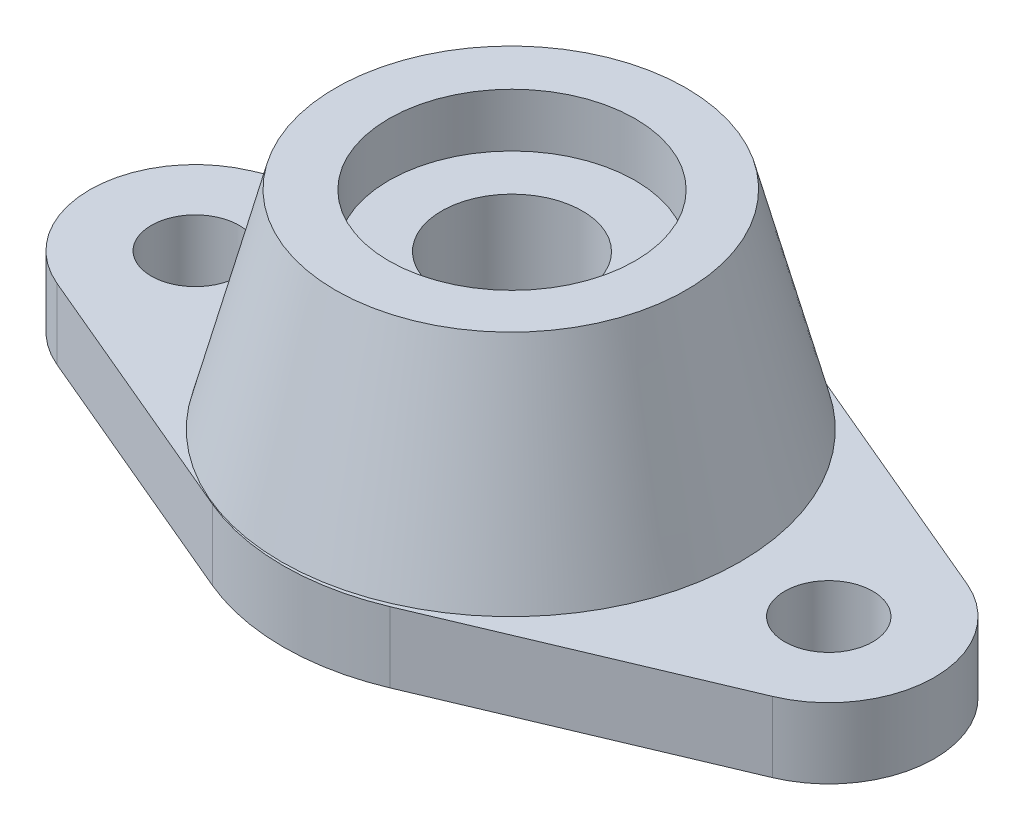
ISO-10303-21;
HEADER;
FILE_DESCRIPTION(('STEP AP214'),'2;1');
FILE_NAME('part.step','',(''),(''),'','','');
FILE_SCHEMA(('AUTOMOTIVE_DESIGN { 1 0 10303 214 1 1 1 1 }'));
ENDSEC;
DATA;
#1=APPLICATION_CONTEXT('core data for automotive mechanical design processes');
#2=APPLICATION_PROTOCOL_DEFINITION('international standard','automotive_design',2000,#1);
#3=PRODUCT_CONTEXT('',#1,'mechanical');
#4=PRODUCT('Part','Part','',(#3));
#5=PRODUCT_RELATED_PRODUCT_CATEGORY('part','',(#4));
#6=PRODUCT_DEFINITION_FORMATION('','',#4);
#7=PRODUCT_DEFINITION_CONTEXT('part definition',#1,'design');
#8=PRODUCT_DEFINITION('design','',#6,#7);
#9=PRODUCT_DEFINITION_SHAPE('','',#8);
#10=(LENGTH_UNIT() NAMED_UNIT(*) SI_UNIT(.MILLI.,.METRE.));
#11=(NAMED_UNIT(*) PLANE_ANGLE_UNIT() SI_UNIT($,.RADIAN.));
#12=(NAMED_UNIT(*) SI_UNIT($,.STERADIAN.) SOLID_ANGLE_UNIT());
#13=UNCERTAINTY_MEASURE_WITH_UNIT(LENGTH_MEASURE(1.E-05),#10,'distance_accuracy_value','');
#14=(GEOMETRIC_REPRESENTATION_CONTEXT(3) GLOBAL_UNCERTAINTY_ASSIGNED_CONTEXT((#13)) GLOBAL_UNIT_ASSIGNED_CONTEXT((#10,
#11,#12)) REPRESENTATION_CONTEXT('',''));
#15=CARTESIAN_POINT('',(0.,0.,0.));
#16=DIRECTION('',(0.,0.,1.));
#17=DIRECTION('',(1.,0.,0.));
#18=AXIS2_PLACEMENT_3D('',#15,#16,#17);
#19=CARTESIAN_POINT('',(41.1844595659896,13.2676954235819,0.));
#20=DIRECTION('',(0.,-1.,0.));
#21=DIRECTION('',(0.,0.,-1.));
#22=AXIS2_PLACEMENT_3D('',#19,#20,#21);
#23=PLANE('',#22);
#24=CARTESIAN_POINT('',(0.,13.2676954235819,0.));
#25=DIRECTION('',(0.,-1.,0.));
#26=DIRECTION('',(0.,0.,-1.));
#27=AXIS2_PLACEMENT_3D('',#24,#25,#26);
#28=CIRCLE('',#27,19.05);
#29=CARTESIAN_POINT('',(0.,13.2676954235819,-19.05));
#30=VERTEX_POINT('',#29);
#31=EDGE_CURVE('E54',#30,#30,#28,.F.);
#32=ORIENTED_EDGE('',*,*,#31,.T.);
#33=EDGE_LOOP('',(#32));
#34=FACE_BOUND('',#33,.T.);
#35=CARTESIAN_POINT('',(-0.217540434010357,13.2676954235819,0.));
#36=DIRECTION('',(0.,-1.,0.));
#37=DIRECTION('',(0.,0.,-1.));
#38=AXIS2_PLACEMENT_3D('',#35,#36,#37);
#39=CIRCLE('',#38,41.402);
#40=CARTESIAN_POINT('',(-0.217540434010357,13.2676954235819,-41.402));
#41=VERTEX_POINT('',#40);
#42=EDGE_CURVE('E59',#41,#41,#39,.T.);
#43=ORIENTED_EDGE('',*,*,#42,.T.);
#44=EDGE_LOOP('',(#43));
#45=FACE_BOUND('',#44,.T.);
#46=ADVANCED_FACE('F51',(#34,#45),#23,.T.);
#47=CARTESIAN_POINT('',(-0.217540434010357,50.8,0.));
#48=DIRECTION('',(0.,1.,0.));
#49=DIRECTION('',(0.,0.,1.));
#50=AXIS2_PLACEMENT_3D('',#47,#48,#49);
#51=PLANE('',#50);
#52=CARTESIAN_POINT('',(0.,50.8,0.));
#53=DIRECTION('',(0.,1.,0.));
#54=DIRECTION('',(0.,0.,1.));
#55=AXIS2_PLACEMENT_3D('',#52,#53,#54);
#56=CIRCLE('',#55,22.225);
#57=CARTESIAN_POINT('',(0.,50.8,22.225));
#58=VERTEX_POINT('',#57);
#59=EDGE_CURVE('E66',#58,#58,#56,.T.);
#60=ORIENTED_EDGE('',*,*,#59,.F.);
#61=EDGE_LOOP('',(#60));
#62=FACE_BOUND('',#61,.T.);
#63=CARTESIAN_POINT('',(-0.217540434010357,50.8,0.));
#64=DIRECTION('',(0.,-1.,0.));
#65=DIRECTION('',(0.,0.,-1.));
#66=AXIS2_PLACEMENT_3D('',#63,#64,#65);
#67=CIRCLE('',#66,31.6178702226304);
#68=CARTESIAN_POINT('',(-0.217540434010357,50.8,-31.6178702226304));
#69=VERTEX_POINT('',#68);
#70=EDGE_CURVE('E11',#69,#69,#67,.T.);
#71=ORIENTED_EDGE('',*,*,#70,.F.);
#72=EDGE_LOOP('',(#71));
#73=FACE_BOUND('',#72,.T.);
#74=ADVANCED_FACE('F104',(#62,#73),#51,.T.);
#75=CARTESIAN_POINT('',(-0.217540434010357,13.2676954235819,0.));
#76=DIRECTION('',(0.,-1.,0.));
#77=DIRECTION('',(0.,0.,-1.));
#78=AXIS2_PLACEMENT_3D('',#75,#76,#77);
#79=CONICAL_SURFACE('',#78,41.402,0.255010100410673);
#80=ORIENTED_EDGE('',*,*,#70,.T.);
#81=EDGE_LOOP('',(#80));
#82=FACE_BOUND('',#81,.T.);
#83=ORIENTED_EDGE('',*,*,#42,.F.);
#84=EDGE_LOOP('',(#83));
#85=FACE_BOUND('',#84,.T.);
#86=ADVANCED_FACE('F109',(#82,#85),#79,.T.);
#87=CARTESIAN_POINT('',(0.,50.8,0.));
#88=DIRECTION('',(0.,1.,0.));
#89=DIRECTION('',(0.,0.,1.));
#90=AXIS2_PLACEMENT_3D('',#87,#88,#89);
#91=CYLINDRICAL_SURFACE('',#90,22.225);
#92=ORIENTED_EDGE('',*,*,#59,.T.);
#93=EDGE_LOOP('',(#92));
#94=FACE_BOUND('',#93,.T.);
#95=CARTESIAN_POINT('',(0.,41.148,0.));
#96=DIRECTION('',(0.,1.,0.));
#97=DIRECTION('',(0.,0.,1.));
#98=AXIS2_PLACEMENT_3D('',#95,#96,#97);
#99=CIRCLE('',#98,22.225);
#100=CARTESIAN_POINT('',(0.,41.148,22.225));
#101=VERTEX_POINT('',#100);
#102=EDGE_CURVE('E70',#101,#101,#99,.T.);
#103=ORIENTED_EDGE('',*,*,#102,.F.);
#104=EDGE_LOOP('',(#103));
#105=FACE_BOUND('',#104,.T.);
#106=ADVANCED_FACE('F117',(#94,#105),#91,.F.);
#107=CARTESIAN_POINT('',(22.225,41.148,0.));
#108=DIRECTION('',(0.,1.,0.));
#109=DIRECTION('',(0.,0.,1.));
#110=AXIS2_PLACEMENT_3D('',#107,#108,#109);
#111=PLANE('',#110);
#112=ORIENTED_EDGE('',*,*,#102,.T.);
#113=EDGE_LOOP('',(#112));
#114=FACE_BOUND('',#113,.T.);
#115=CARTESIAN_POINT('',(0.,41.148,0.));
#116=DIRECTION('',(0.,1.,0.));
#117=DIRECTION('',(0.,0.,1.));
#118=AXIS2_PLACEMENT_3D('',#115,#116,#117);
#119=CIRCLE('',#118,12.7);
#120=CARTESIAN_POINT('',(0.,41.148,12.7));
#121=VERTEX_POINT('',#120);
#122=EDGE_CURVE('E74',#121,#121,#119,.T.);
#123=ORIENTED_EDGE('',*,*,#122,.F.);
#124=EDGE_LOOP('',(#123));
#125=FACE_BOUND('',#124,.T.);
#126=ADVANCED_FACE('F100',(#114,#125),#111,.T.);
#127=CARTESIAN_POINT('',(0.,50.8,0.));
#128=DIRECTION('',(0.,1.,0.));
#129=DIRECTION('',(0.,0.,1.));
#130=AXIS2_PLACEMENT_3D('',#127,#128,#129);
#131=CYLINDRICAL_SURFACE('',#130,12.7);
#132=ORIENTED_EDGE('',*,*,#122,.T.);
#133=EDGE_LOOP('',(#132));
#134=FACE_BOUND('',#133,.T.);
#135=CARTESIAN_POINT('',(0.,25.4,0.));
#136=DIRECTION('',(0.,1.,0.));
#137=DIRECTION('',(0.,0.,1.));
#138=AXIS2_PLACEMENT_3D('',#135,#136,#137);
#139=CIRCLE('',#138,12.7);
#140=CARTESIAN_POINT('',(0.,25.4,12.7));
#141=VERTEX_POINT('',#140);
#142=EDGE_CURVE('E78',#141,#141,#139,.T.);
#143=ORIENTED_EDGE('',*,*,#142,.F.);
#144=EDGE_LOOP('',(#143));
#145=FACE_BOUND('',#144,.T.);
#146=ADVANCED_FACE('F91',(#134,#145),#131,.F.);
#147=CARTESIAN_POINT('',(0.,19.05,0.));
#148=DIRECTION('',(0.,-1.,0.));
#149=DIRECTION('',(0.,0.,-1.));
#150=AXIS2_PLACEMENT_3D('',#147,#148,#149);
#151=CONICAL_SURFACE('',#150,19.05,0.785398163397448);
#152=ORIENTED_EDGE('',*,*,#142,.T.);
#153=EDGE_LOOP('',(#152));
#154=FACE_BOUND('',#153,.T.);
#155=CARTESIAN_POINT('',(0.,19.05,0.));
#156=DIRECTION('',(0.,1.,0.));
#157=DIRECTION('',(0.,0.,1.));
#158=AXIS2_PLACEMENT_3D('',#155,#156,#157);
#159=CIRCLE('',#158,19.05);
#160=CARTESIAN_POINT('',(0.,19.05,19.05));
#161=VERTEX_POINT('',#160);
#162=EDGE_CURVE('E82',#161,#161,#159,.T.);
#163=ORIENTED_EDGE('',*,*,#162,.F.);
#164=EDGE_LOOP('',(#163));
#165=FACE_BOUND('',#164,.T.);
#166=ADVANCED_FACE('F89',(#154,#165),#151,.F.);
#167=CARTESIAN_POINT('',(0.,50.8,0.));
#168=DIRECTION('',(0.,1.,0.));
#169=DIRECTION('',(0.,0.,1.));
#170=AXIS2_PLACEMENT_3D('',#167,#168,#169);
#171=CYLINDRICAL_SURFACE('',#170,19.05);
#172=ORIENTED_EDGE('',*,*,#31,.F.);
#173=EDGE_LOOP('',(#172));
#174=FACE_BOUND('',#173,.T.);
#175=ORIENTED_EDGE('',*,*,#162,.T.);
#176=EDGE_LOOP('',(#175));
#177=FACE_BOUND('',#176,.T.);
#178=ADVANCED_FACE('F87',(#174,#177),#171,.F.);
#179=CLOSED_SHELL('',(#46,#74,#86,#106,#126,#146,#166,#178));
#180=MANIFOLD_SOLID_BREP('B2',#179);
#181=CARTESIAN_POINT('',(-57.15,12.7,0.));
#182=DIRECTION('',(0.,1.,0.));
#183=DIRECTION('',(0.,0.,1.));
#184=AXIS2_PLACEMENT_3D('',#181,#182,#183);
#185=PLANE('',#184);
#186=CARTESIAN_POINT('',(0.,12.7,0.));
#187=DIRECTION('',(0.,1.,0.));
#188=DIRECTION('',(0.,0.,1.));
#189=AXIS2_PLACEMENT_3D('',#186,#187,#188);
#190=CIRCLE('',#189,19.05);
#191=CARTESIAN_POINT('',(0.,12.7,19.05));
#192=VERTEX_POINT('',#191);
#193=EDGE_CURVE('E355',#192,#192,#190,.F.);
#194=ORIENTED_EDGE('',*,*,#193,.T.);
#195=EDGE_LOOP('',(#194));
#196=FACE_BOUND('',#195,.T.);
#197=CARTESIAN_POINT('',(-57.15,12.7,0.));
#198=DIRECTION('',(0.,1.,0.));
#199=DIRECTION('',(0.,0.,1.));
#200=AXIS2_PLACEMENT_3D('',#197,#198,#199);
#201=CIRCLE('',#200,7.9375);
#202=CARTESIAN_POINT('',(-57.15,12.7,7.9375));
#203=VERTEX_POINT('',#202);
#204=EDGE_CURVE('E301',#203,#203,#201,.T.);
#205=ORIENTED_EDGE('',*,*,#204,.F.);
#206=EDGE_LOOP('',(#205));
#207=FACE_BOUND('',#206,.T.);
#208=CARTESIAN_POINT('',(-57.15,12.7,0.));
#209=DIRECTION('',(0.,1.,0.));
#210=DIRECTION('',(0.,0.,1.));
#211=AXIS2_PLACEMENT_3D('',#208,#209,#210);
#212=CIRCLE('',#211,19.05);
#213=CARTESIAN_POINT('',(-64.5583333333333,12.7,-17.550472848964));
#214=VERTEX_POINT('',#213);
#215=CARTESIAN_POINT('',(-64.5583333333333,12.7,17.550472848964));
#216=VERTEX_POINT('',#215);
#217=EDGE_CURVE('E312',#214,#216,#212,.T.);
#218=ORIENTED_EDGE('',*,*,#217,.T.);
#219=DIRECTION('',(0.921284663987611,0.,0.388888888888889));
#220=VECTOR('',#219,1.);
#221=CARTESIAN_POINT('',(-64.5583333333333,12.7,17.550472848964));
#222=LINE('',#221,#220);
#223=CARTESIAN_POINT('',(-16.0513888888889,12.7,38.0260245060886));
#224=VERTEX_POINT('',#223);
#225=EDGE_CURVE('E260',#216,#224,#222,.T.);
#226=ORIENTED_EDGE('',*,*,#225,.T.);
#227=CARTESIAN_POINT('',(0.,12.7,0.));
#228=DIRECTION('',(0.,1.,0.));
#229=DIRECTION('',(0.,0.,1.));
#230=AXIS2_PLACEMENT_3D('',#227,#228,#229);
#231=CIRCLE('',#230,41.275);
#232=CARTESIAN_POINT('',(16.0513888888889,12.7,38.0260245060886));
#233=VERTEX_POINT('',#232);
#234=EDGE_CURVE('E327',#224,#233,#231,.T.);
#235=ORIENTED_EDGE('',*,*,#234,.T.);
#236=DIRECTION('',(0.921284663987611,0.,-0.388888888888889));
#237=VECTOR('',#236,1.);
#238=CARTESIAN_POINT('',(64.5583333333334,12.7,17.550472848964));
#239=LINE('',#238,#237);
#240=CARTESIAN_POINT('',(64.5583333333334,12.7,17.550472848964));
#241=VERTEX_POINT('',#240);
#242=EDGE_CURVE('E340',#233,#241,#239,.T.);
#243=ORIENTED_EDGE('',*,*,#242,.T.);
#244=CARTESIAN_POINT('',(57.15,12.7,0.));
#245=DIRECTION('',(0.,1.,0.));
#246=DIRECTION('',(0.,0.,1.));
#247=AXIS2_PLACEMENT_3D('',#244,#245,#246);
#248=CIRCLE('',#247,19.05);
#249=CARTESIAN_POINT('',(64.5583333333333,12.7,-17.550472848964));
#250=VERTEX_POINT('',#249);
#251=EDGE_CURVE('E279',#241,#250,#248,.T.);
#252=ORIENTED_EDGE('',*,*,#251,.T.);
#253=DIRECTION('',(-0.921284663987611,0.,-0.388888888888888));
#254=VECTOR('',#253,1.);
#255=CARTESIAN_POINT('',(64.5583333333333,12.7,-17.550472848964));
#256=LINE('',#255,#254);
#257=CARTESIAN_POINT('',(16.0513888888889,12.7,-38.0260245060887));
#258=VERTEX_POINT('',#257);
#259=EDGE_CURVE('E273',#250,#258,#256,.T.);
#260=ORIENTED_EDGE('',*,*,#259,.T.);
#261=CARTESIAN_POINT('',(0.,12.7,0.));
#262=DIRECTION('',(0.,1.,0.));
#263=DIRECTION('',(0.,0.,1.));
#264=AXIS2_PLACEMENT_3D('',#261,#262,#263);
#265=CIRCLE('',#264,41.275);
#266=CARTESIAN_POINT('',(-16.0513888888889,12.7,-38.0260245060886));
#267=VERTEX_POINT('',#266);
#268=EDGE_CURVE('E277',#258,#267,#265,.T.);
#269=ORIENTED_EDGE('',*,*,#268,.T.);
#270=DIRECTION('',(-0.921284663987611,0.,0.388888888888889));
#271=VECTOR('',#270,1.);
#272=CARTESIAN_POINT('',(-64.5583333333333,12.7,-17.550472848964));
#273=LINE('',#272,#271);
#274=EDGE_CURVE('E217',#267,#214,#273,.T.);
#275=ORIENTED_EDGE('',*,*,#274,.T.);
#276=EDGE_LOOP('',(#218,#226,#235,#243,#252,#260,#269,#275));
#277=FACE_BOUND('',#276,.T.);
#278=CARTESIAN_POINT('',(57.15,12.7,0.));
#279=DIRECTION('',(0.,1.,0.));
#280=DIRECTION('',(0.,0.,1.));
#281=AXIS2_PLACEMENT_3D('',#278,#279,#280);
#282=CIRCLE('',#281,7.93749999999999);
#283=CARTESIAN_POINT('',(57.15,12.7,7.93749999999998));
#284=VERTEX_POINT('',#283);
#285=EDGE_CURVE('E349',#284,#284,#282,.T.);
#286=ORIENTED_EDGE('',*,*,#285,.F.);
#287=EDGE_LOOP('',(#286));
#288=FACE_BOUND('',#287,.T.);
#289=ADVANCED_FACE('F200',(#196,#207,#277,#288),#185,.T.);
#290=CARTESIAN_POINT('',(-57.15,0.,0.));
#291=DIRECTION('',(0.,1.,0.));
#292=DIRECTION('',(0.,0.,1.));
#293=AXIS2_PLACEMENT_3D('',#290,#291,#292);
#294=PLANE('',#293);
#295=CARTESIAN_POINT('',(0.,0.,0.));
#296=DIRECTION('',(0.,1.,0.));
#297=DIRECTION('',(0.,0.,1.));
#298=AXIS2_PLACEMENT_3D('',#295,#296,#297);
#299=CIRCLE('',#298,19.05);
#300=CARTESIAN_POINT('',(0.,0.,19.05));
#301=VERTEX_POINT('',#300);
#302=EDGE_CURVE('E360',#301,#301,#299,.T.);
#303=ORIENTED_EDGE('',*,*,#302,.T.);
#304=EDGE_LOOP('',(#303));
#305=FACE_BOUND('',#304,.T.);
#306=CARTESIAN_POINT('',(-57.15,0.,0.));
#307=DIRECTION('',(0.,1.,0.));
#308=DIRECTION('',(0.,0.,1.));
#309=AXIS2_PLACEMENT_3D('',#306,#307,#308);
#310=CIRCLE('',#309,19.05);
#311=CARTESIAN_POINT('',(-64.5583333333333,0.,-17.550472848964));
#312=VERTEX_POINT('',#311);
#313=CARTESIAN_POINT('',(-64.5583333333333,0.,17.550472848964));
#314=VERTEX_POINT('',#313);
#315=EDGE_CURVE('E297',#312,#314,#310,.T.);
#316=ORIENTED_EDGE('',*,*,#315,.F.);
#317=DIRECTION('',(-0.921284663987611,0.,0.388888888888889));
#318=VECTOR('',#317,1.);
#319=CARTESIAN_POINT('',(-64.5583333333333,0.,-17.550472848964));
#320=LINE('',#319,#318);
#321=CARTESIAN_POINT('',(-16.0513888888889,0.,-38.0260245060886));
#322=VERTEX_POINT('',#321);
#323=EDGE_CURVE('E252',#322,#312,#320,.T.);
#324=ORIENTED_EDGE('',*,*,#323,.F.);
#325=CARTESIAN_POINT('',(0.,0.,0.));
#326=DIRECTION('',(0.,1.,0.));
#327=DIRECTION('',(0.,0.,1.));
#328=AXIS2_PLACEMENT_3D('',#325,#326,#327);
#329=CIRCLE('',#328,41.275);
#330=CARTESIAN_POINT('',(16.0513888888889,0.,-38.0260245060887));
#331=VERTEX_POINT('',#330);
#332=EDGE_CURVE('E246',#331,#322,#329,.T.);
#333=ORIENTED_EDGE('',*,*,#332,.F.);
#334=DIRECTION('',(-0.921284663987611,0.,-0.388888888888888));
#335=VECTOR('',#334,1.);
#336=CARTESIAN_POINT('',(64.5583333333333,0.,-17.550472848964));
#337=LINE('',#336,#335);
#338=CARTESIAN_POINT('',(64.5583333333333,0.,-17.550472848964));
#339=VERTEX_POINT('',#338);
#340=EDGE_CURVE('E287',#339,#331,#337,.T.);
#341=ORIENTED_EDGE('',*,*,#340,.F.);
#342=CARTESIAN_POINT('',(57.15,0.,0.));
#343=DIRECTION('',(0.,1.,0.));
#344=DIRECTION('',(0.,0.,1.));
#345=AXIS2_PLACEMENT_3D('',#342,#343,#344);
#346=CIRCLE('',#345,19.05);
#347=CARTESIAN_POINT('',(64.5583333333334,0.,17.550472848964));
#348=VERTEX_POINT('',#347);
#349=EDGE_CURVE('E307',#348,#339,#346,.T.);
#350=ORIENTED_EDGE('',*,*,#349,.F.);
#351=DIRECTION('',(0.921284663987611,0.,-0.388888888888889));
#352=VECTOR('',#351,1.);
#353=CARTESIAN_POINT('',(64.5583333333334,0.,17.550472848964));
#354=LINE('',#353,#352);
#355=CARTESIAN_POINT('',(16.0513888888889,0.,38.0260245060886));
#356=VERTEX_POINT('',#355);
#357=EDGE_CURVE('E305',#356,#348,#354,.T.);
#358=ORIENTED_EDGE('',*,*,#357,.F.);
#359=CARTESIAN_POINT('',(0.,0.,0.));
#360=DIRECTION('',(0.,1.,0.));
#361=DIRECTION('',(0.,0.,1.));
#362=AXIS2_PLACEMENT_3D('',#359,#360,#361);
#363=CIRCLE('',#362,41.275);
#364=CARTESIAN_POINT('',(-16.0513888888889,0.,38.0260245060886));
#365=VERTEX_POINT('',#364);
#366=EDGE_CURVE('E303',#365,#356,#363,.T.);
#367=ORIENTED_EDGE('',*,*,#366,.F.);
#368=DIRECTION('',(0.921284663987611,0.,0.388888888888889));
#369=VECTOR('',#368,1.);
#370=CARTESIAN_POINT('',(-64.5583333333333,0.,17.550472848964));
#371=LINE('',#370,#369);
#372=EDGE_CURVE('E300',#314,#365,#371,.T.);
#373=ORIENTED_EDGE('',*,*,#372,.F.);
#374=EDGE_LOOP('',(#316,#324,#333,#341,#350,#358,#367,#373));
#375=FACE_BOUND('',#374,.T.);
#376=CARTESIAN_POINT('',(-57.15,0.,0.));
#377=DIRECTION('',(0.,1.,0.));
#378=DIRECTION('',(0.,0.,1.));
#379=AXIS2_PLACEMENT_3D('',#376,#377,#378);
#380=CIRCLE('',#379,7.9375);
#381=CARTESIAN_POINT('',(-57.15,0.,7.9375));
#382=VERTEX_POINT('',#381);
#383=EDGE_CURVE('E346',#382,#382,#380,.T.);
#384=ORIENTED_EDGE('',*,*,#383,.T.);
#385=EDGE_LOOP('',(#384));
#386=FACE_BOUND('',#385,.T.);
#387=CARTESIAN_POINT('',(57.15,0.,0.));
#388=DIRECTION('',(0.,1.,0.));
#389=DIRECTION('',(0.,0.,1.));
#390=AXIS2_PLACEMENT_3D('',#387,#388,#389);
#391=CIRCLE('',#390,7.93749999999999);
#392=CARTESIAN_POINT('',(57.15,0.,7.93749999999998));
#393=VERTEX_POINT('',#392);
#394=EDGE_CURVE('E352',#393,#393,#391,.T.);
#395=ORIENTED_EDGE('',*,*,#394,.T.);
#396=EDGE_LOOP('',(#395));
#397=FACE_BOUND('',#396,.T.);
#398=ADVANCED_FACE('F331',(#305,#375,#386,#397),#294,.F.);
#399=CARTESIAN_POINT('',(-57.15,12.7,0.));
#400=DIRECTION('',(0.,-1.,0.));
#401=DIRECTION('',(0.,0.,-1.));
#402=AXIS2_PLACEMENT_3D('',#399,#400,#401);
#403=CYLINDRICAL_SURFACE('',#402,19.05);
#404=ORIENTED_EDGE('',*,*,#315,.T.);
#405=DIRECTION('',(0.,-1.,0.));
#406=VECTOR('',#405,1.);
#407=CARTESIAN_POINT('',(-64.5583333333333,12.7,17.550472848964));
#408=LINE('',#407,#406);
#409=EDGE_CURVE('E49',#216,#314,#408,.T.);
#410=ORIENTED_EDGE('',*,*,#409,.F.);
#411=ORIENTED_EDGE('',*,*,#217,.F.);
#412=DIRECTION('',(0.,-1.,0.));
#413=VECTOR('',#412,1.);
#414=CARTESIAN_POINT('',(-64.5583333333333,12.7,-17.550472848964));
#415=LINE('',#414,#413);
#416=EDGE_CURVE('E293',#214,#312,#415,.T.);
#417=ORIENTED_EDGE('',*,*,#416,.T.);
#418=EDGE_LOOP('',(#404,#410,#411,#417));
#419=FACE_BOUND('',#418,.T.);
#420=ADVANCED_FACE('F202',(#419),#403,.T.);
#421=CARTESIAN_POINT('',(-64.5583333333333,12.7,17.550472848964));
#422=DIRECTION('',(0.388888888888889,0.,-0.921284663987611));
#423=DIRECTION('',(-0.921284663987611,0.,-0.388888888888889));
#424=AXIS2_PLACEMENT_3D('',#421,#422,#423);
#425=PLANE('',#424);
#426=ORIENTED_EDGE('',*,*,#372,.T.);
#427=DIRECTION('',(0.,-1.,0.));
#428=VECTOR('',#427,1.);
#429=CARTESIAN_POINT('',(-16.0513888888889,12.7,38.0260245060886));
#430=LINE('',#429,#428);
#431=EDGE_CURVE('E209',#224,#365,#430,.T.);
#432=ORIENTED_EDGE('',*,*,#431,.F.);
#433=ORIENTED_EDGE('',*,*,#225,.F.);
#434=ORIENTED_EDGE('',*,*,#409,.T.);
#435=EDGE_LOOP('',(#426,#432,#433,#434));
#436=FACE_BOUND('',#435,.T.);
#437=ADVANCED_FACE('F399',(#436),#425,.F.);
#438=CARTESIAN_POINT('',(0.,12.7,0.));
#439=DIRECTION('',(0.,-1.,0.));
#440=DIRECTION('',(0.,0.,-1.));
#441=AXIS2_PLACEMENT_3D('',#438,#439,#440);
#442=CYLINDRICAL_SURFACE('',#441,41.275);
#443=ORIENTED_EDGE('',*,*,#366,.T.);
#444=DIRECTION('',(0.,-1.,0.));
#445=VECTOR('',#444,1.);
#446=CARTESIAN_POINT('',(16.0513888888889,12.7,38.0260245060886));
#447=LINE('',#446,#445);
#448=EDGE_CURVE('E319',#233,#356,#447,.T.);
#449=ORIENTED_EDGE('',*,*,#448,.F.);
#450=ORIENTED_EDGE('',*,*,#234,.F.);
#451=ORIENTED_EDGE('',*,*,#431,.T.);
#452=EDGE_LOOP('',(#443,#449,#450,#451));
#453=FACE_BOUND('',#452,.T.);
#454=ADVANCED_FACE('F325',(#453),#442,.T.);
#455=CARTESIAN_POINT('',(64.5583333333334,12.7,17.550472848964));
#456=DIRECTION('',(-0.388888888888889,0.,-0.921284663987611));
#457=DIRECTION('',(-0.921284663987611,0.,0.388888888888889));
#458=AXIS2_PLACEMENT_3D('',#455,#456,#457);
#459=PLANE('',#458);
#460=ORIENTED_EDGE('',*,*,#357,.T.);
#461=DIRECTION('',(0.,-1.,0.));
#462=VECTOR('',#461,1.);
#463=CARTESIAN_POINT('',(64.5583333333334,12.7,17.550472848964));
#464=LINE('',#463,#462);
#465=EDGE_CURVE('E316',#241,#348,#464,.T.);
#466=ORIENTED_EDGE('',*,*,#465,.F.);
#467=ORIENTED_EDGE('',*,*,#242,.F.);
#468=ORIENTED_EDGE('',*,*,#448,.T.);
#469=EDGE_LOOP('',(#460,#466,#467,#468));
#470=FACE_BOUND('',#469,.T.);
#471=ADVANCED_FACE('F336',(#470),#459,.F.);
#472=CARTESIAN_POINT('',(57.15,12.7,0.));
#473=DIRECTION('',(0.,-1.,0.));
#474=DIRECTION('',(0.,0.,-1.));
#475=AXIS2_PLACEMENT_3D('',#472,#473,#474);
#476=CYLINDRICAL_SURFACE('',#475,19.05);
#477=ORIENTED_EDGE('',*,*,#349,.T.);
#478=DIRECTION('',(0.,-1.,0.));
#479=VECTOR('',#478,1.);
#480=CARTESIAN_POINT('',(64.5583333333333,12.7,-17.550472848964));
#481=LINE('',#480,#479);
#482=EDGE_CURVE('E288',#250,#339,#481,.T.);
#483=ORIENTED_EDGE('',*,*,#482,.F.);
#484=ORIENTED_EDGE('',*,*,#251,.F.);
#485=ORIENTED_EDGE('',*,*,#465,.T.);
#486=EDGE_LOOP('',(#477,#483,#484,#485));
#487=FACE_BOUND('',#486,.T.);
#488=ADVANCED_FACE('F339',(#487),#476,.T.);
#489=CARTESIAN_POINT('',(64.5583333333333,12.7,-17.550472848964));
#490=DIRECTION('',(-0.388888888888888,0.,0.921284663987611));
#491=DIRECTION('',(0.921284663987611,0.,0.388888888888888));
#492=AXIS2_PLACEMENT_3D('',#489,#490,#491);
#493=PLANE('',#492);
#494=ORIENTED_EDGE('',*,*,#340,.T.);
#495=DIRECTION('',(0.,-1.,0.));
#496=VECTOR('',#495,1.);
#497=CARTESIAN_POINT('',(16.0513888888889,12.7,-38.0260245060887));
#498=LINE('',#497,#496);
#499=EDGE_CURVE('E284',#258,#331,#498,.T.);
#500=ORIENTED_EDGE('',*,*,#499,.F.);
#501=ORIENTED_EDGE('',*,*,#259,.F.);
#502=ORIENTED_EDGE('',*,*,#482,.T.);
#503=EDGE_LOOP('',(#494,#500,#501,#502));
#504=FACE_BOUND('',#503,.T.);
#505=ADVANCED_FACE('F285',(#504),#493,.F.);
#506=CARTESIAN_POINT('',(0.,12.7,0.));
#507=DIRECTION('',(0.,-1.,0.));
#508=DIRECTION('',(0.,0.,-1.));
#509=AXIS2_PLACEMENT_3D('',#506,#507,#508);
#510=CYLINDRICAL_SURFACE('',#509,41.275);
#511=ORIENTED_EDGE('',*,*,#332,.T.);
#512=DIRECTION('',(0.,-1.,0.));
#513=VECTOR('',#512,1.);
#514=CARTESIAN_POINT('',(-16.0513888888889,12.7,-38.0260245060886));
#515=LINE('',#514,#513);
#516=EDGE_CURVE('E289',#267,#322,#515,.T.);
#517=ORIENTED_EDGE('',*,*,#516,.F.);
#518=ORIENTED_EDGE('',*,*,#268,.F.);
#519=ORIENTED_EDGE('',*,*,#499,.T.);
#520=EDGE_LOOP('',(#511,#517,#518,#519));
#521=FACE_BOUND('',#520,.T.);
#522=ADVANCED_FACE('F291',(#521),#510,.T.);
#523=CARTESIAN_POINT('',(-64.5583333333333,12.7,-17.550472848964));
#524=DIRECTION('',(0.388888888888889,0.,0.921284663987611));
#525=DIRECTION('',(0.921284663987611,0.,-0.388888888888889));
#526=AXIS2_PLACEMENT_3D('',#523,#524,#525);
#527=PLANE('',#526);
#528=ORIENTED_EDGE('',*,*,#323,.T.);
#529=ORIENTED_EDGE('',*,*,#416,.F.);
#530=ORIENTED_EDGE('',*,*,#274,.F.);
#531=ORIENTED_EDGE('',*,*,#516,.T.);
#532=EDGE_LOOP('',(#528,#529,#530,#531));
#533=FACE_BOUND('',#532,.T.);
#534=ADVANCED_FACE('F387',(#533),#527,.F.);
#535=CARTESIAN_POINT('',(-57.15,12.7,0.));
#536=DIRECTION('',(0.,-1.,0.));
#537=DIRECTION('',(0.,0.,-1.));
#538=AXIS2_PLACEMENT_3D('',#535,#536,#537);
#539=CYLINDRICAL_SURFACE('',#538,7.9375);
#540=ORIENTED_EDGE('',*,*,#204,.T.);
#541=EDGE_LOOP('',(#540));
#542=FACE_BOUND('',#541,.T.);
#543=ORIENTED_EDGE('',*,*,#383,.F.);
#544=EDGE_LOOP('',(#543));
#545=FACE_BOUND('',#544,.T.);
#546=ADVANCED_FACE('F373',(#542,#545),#539,.F.);
#547=CARTESIAN_POINT('',(57.15,12.7,0.));
#548=DIRECTION('',(0.,-1.,0.));
#549=DIRECTION('',(0.,0.,-1.));
#550=AXIS2_PLACEMENT_3D('',#547,#548,#549);
#551=CYLINDRICAL_SURFACE('',#550,7.93749999999999);
#552=ORIENTED_EDGE('',*,*,#285,.T.);
#553=EDGE_LOOP('',(#552));
#554=FACE_BOUND('',#553,.T.);
#555=ORIENTED_EDGE('',*,*,#394,.F.);
#556=EDGE_LOOP('',(#555));
#557=FACE_BOUND('',#556,.T.);
#558=ADVANCED_FACE('F367',(#554,#557),#551,.F.);
#559=CARTESIAN_POINT('',(0.,50.8,0.));
#560=DIRECTION('',(0.,1.,0.));
#561=DIRECTION('',(0.,0.,1.));
#562=AXIS2_PLACEMENT_3D('',#559,#560,#561);
#563=CYLINDRICAL_SURFACE('',#562,19.05);
#564=ORIENTED_EDGE('',*,*,#193,.F.);
#565=EDGE_LOOP('',(#564));
#566=FACE_BOUND('',#565,.T.);
#567=ORIENTED_EDGE('',*,*,#302,.F.);
#568=EDGE_LOOP('',(#567));
#569=FACE_BOUND('',#568,.T.);
#570=ADVANCED_FACE('F365',(#566,#569),#563,.F.);
#571=CLOSED_SHELL('',(#289,#398,#420,#437,#454,#471,#488,#505,#522,#534,#546,#558,#570));
#572=MANIFOLD_SOLID_BREP('B6',#571);
#573=ADVANCED_BREP_SHAPE_REPRESENTATION('',(#18,#180,#572),#14);
#574=SHAPE_DEFINITION_REPRESENTATION(#9,#573);
ENDSEC;
END-ISO-10303-21;
